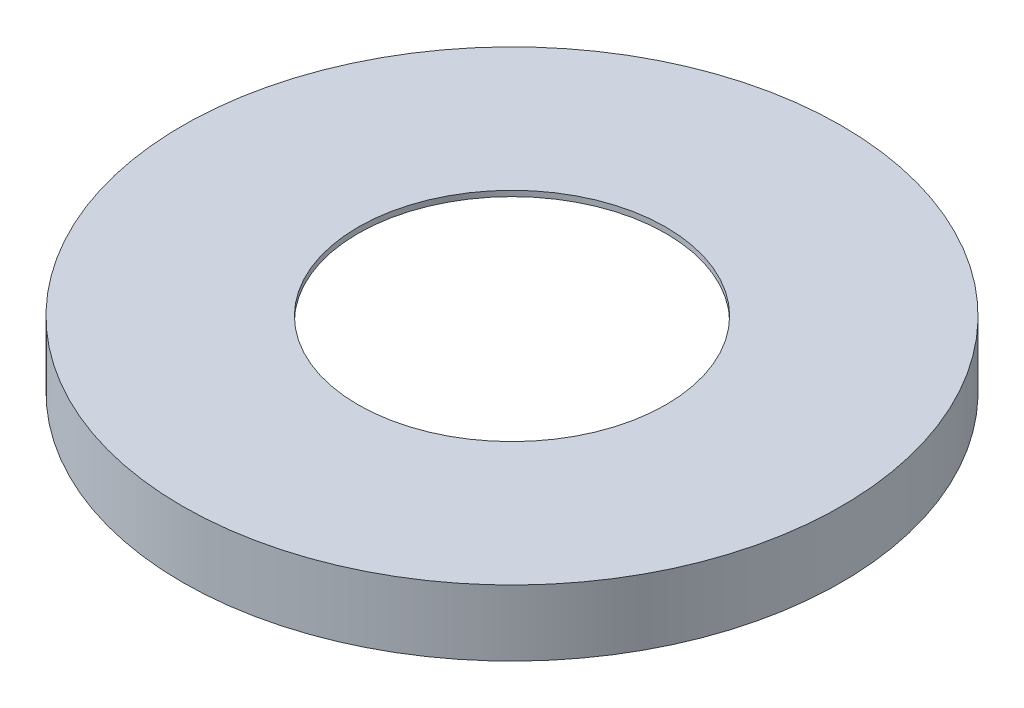
ISO-10303-21;
HEADER;
FILE_DESCRIPTION(('STEP AP214'),'2;1');
FILE_NAME('part.step','',(''),(''),'','','');
FILE_SCHEMA(('AUTOMOTIVE_DESIGN { 1 0 10303 214 1 1 1 1 }'));
ENDSEC;
DATA;
#1=APPLICATION_CONTEXT('core data for automotive mechanical design processes');
#2=APPLICATION_PROTOCOL_DEFINITION('international standard','automotive_design',2000,#1);
#3=PRODUCT_CONTEXT('',#1,'mechanical');
#4=PRODUCT('Part','Part','',(#3));
#5=PRODUCT_RELATED_PRODUCT_CATEGORY('part','',(#4));
#6=PRODUCT_DEFINITION_FORMATION('','',#4);
#7=PRODUCT_DEFINITION_CONTEXT('part definition',#1,'design');
#8=PRODUCT_DEFINITION('design','',#6,#7);
#9=PRODUCT_DEFINITION_SHAPE('','',#8);
#10=(LENGTH_UNIT() NAMED_UNIT(*) SI_UNIT(.MILLI.,.METRE.));
#11=(NAMED_UNIT(*) PLANE_ANGLE_UNIT() SI_UNIT($,.RADIAN.));
#12=(NAMED_UNIT(*) SI_UNIT($,.STERADIAN.) SOLID_ANGLE_UNIT());
#13=UNCERTAINTY_MEASURE_WITH_UNIT(LENGTH_MEASURE(1.E-05),#10,'distance_accuracy_value','');
#14=(GEOMETRIC_REPRESENTATION_CONTEXT(3) GLOBAL_UNCERTAINTY_ASSIGNED_CONTEXT((#13)) GLOBAL_UNIT_ASSIGNED_CONTEXT((#10,
#11,#12)) REPRESENTATION_CONTEXT('',''));
#15=CARTESIAN_POINT('',(0.,0.,0.));
#16=DIRECTION('',(0.,0.,1.));
#17=DIRECTION('',(1.,0.,0.));
#18=AXIS2_PLACEMENT_3D('',#15,#16,#17);
#19=CARTESIAN_POINT('',(0.,6.,0.));
#20=DIRECTION('',(0.,-1.,0.));
#21=DIRECTION('',(0.,0.,-1.));
#22=AXIS2_PLACEMENT_3D('',#19,#20,#21);
#23=CYLINDRICAL_SURFACE('',#22,14.01);
#24=CARTESIAN_POINT('',(0.,6.,0.));
#25=DIRECTION('',(0.,1.,0.));
#26=DIRECTION('',(0.,0.,1.));
#27=AXIS2_PLACEMENT_3D('',#24,#25,#26);
#28=CIRCLE('',#27,14.01);
#29=CARTESIAN_POINT('',(0.,6.,14.01));
#30=VERTEX_POINT('',#29);
#31=EDGE_CURVE('E56',#30,#30,#28,.T.);
#32=ORIENTED_EDGE('',*,*,#31,.T.);
#33=EDGE_LOOP('',(#32));
#34=FACE_BOUND('',#33,.T.);
#35=CARTESIAN_POINT('',(0.,5.5,0.));
#36=DIRECTION('',(0.,-1.,0.));
#37=DIRECTION('',(0.,0.,-1.));
#38=AXIS2_PLACEMENT_3D('',#35,#36,#37);
#39=CIRCLE('',#38,14.01);
#40=CARTESIAN_POINT('',(0.,5.5,-14.01));
#41=VERTEX_POINT('',#40);
#42=EDGE_CURVE('E45',#41,#41,#39,.T.);
#43=ORIENTED_EDGE('',*,*,#42,.T.);
#44=EDGE_LOOP('',(#43));
#45=FACE_BOUND('',#44,.T.);
#46=ADVANCED_FACE('F41',(#34,#45),#23,.F.);
#47=CARTESIAN_POINT('',(0.,6.,0.));
#48=DIRECTION('',(0.,1.,0.));
#49=DIRECTION('',(0.,0.,1.));
#50=AXIS2_PLACEMENT_3D('',#47,#48,#49);
#51=PLANE('',#50);
#52=CARTESIAN_POINT('',(0.,6.,0.));
#53=DIRECTION('',(0.,1.,0.));
#54=DIRECTION('',(0.,0.,1.));
#55=AXIS2_PLACEMENT_3D('',#52,#53,#54);
#56=CIRCLE('',#55,30.);
#57=CARTESIAN_POINT('',(0.,6.,30.));
#58=VERTEX_POINT('',#57);
#59=EDGE_CURVE('E10',#58,#58,#56,.T.);
#60=ORIENTED_EDGE('',*,*,#59,.T.);
#61=EDGE_LOOP('',(#60));
#62=FACE_BOUND('',#61,.T.);
#63=ORIENTED_EDGE('',*,*,#31,.F.);
#64=EDGE_LOOP('',(#63));
#65=FACE_BOUND('',#64,.T.);
#66=ADVANCED_FACE('F85',(#62,#65),#51,.T.);
#67=CARTESIAN_POINT('',(0.,0.,0.));
#68=DIRECTION('',(0.,1.,0.));
#69=DIRECTION('',(0.,0.,1.));
#70=AXIS2_PLACEMENT_3D('',#67,#68,#69);
#71=PLANE('',#70);
#72=CARTESIAN_POINT('',(0.,0.,0.));
#73=DIRECTION('',(0.,-1.,0.));
#74=DIRECTION('',(0.,0.,-1.));
#75=AXIS2_PLACEMENT_3D('',#72,#73,#74);
#76=CIRCLE('',#75,29.);
#77=CARTESIAN_POINT('',(0.,0.,-29.));
#78=VERTEX_POINT('',#77);
#79=EDGE_CURVE('E61',#78,#78,#76,.T.);
#80=ORIENTED_EDGE('',*,*,#79,.F.);
#81=EDGE_LOOP('',(#80));
#82=FACE_BOUND('',#81,.T.);
#83=CARTESIAN_POINT('',(0.,0.,0.));
#84=DIRECTION('',(0.,1.,0.));
#85=DIRECTION('',(0.,0.,1.));
#86=AXIS2_PLACEMENT_3D('',#83,#84,#85);
#87=CIRCLE('',#86,30.);
#88=CARTESIAN_POINT('',(0.,0.,30.));
#89=VERTEX_POINT('',#88);
#90=EDGE_CURVE('E50',#89,#89,#87,.T.);
#91=ORIENTED_EDGE('',*,*,#90,.F.);
#92=EDGE_LOOP('',(#91));
#93=FACE_BOUND('',#92,.T.);
#94=ADVANCED_FACE('F91',(#82,#93),#71,.F.);
#95=CARTESIAN_POINT('',(0.,6.,0.));
#96=DIRECTION('',(0.,-1.,0.));
#97=DIRECTION('',(0.,0.,-1.));
#98=AXIS2_PLACEMENT_3D('',#95,#96,#97);
#99=CYLINDRICAL_SURFACE('',#98,30.);
#100=ORIENTED_EDGE('',*,*,#59,.F.);
#101=EDGE_LOOP('',(#100));
#102=FACE_BOUND('',#101,.T.);
#103=ORIENTED_EDGE('',*,*,#90,.T.);
#104=EDGE_LOOP('',(#103));
#105=FACE_BOUND('',#104,.T.);
#106=ADVANCED_FACE('F43',(#102,#105),#99,.T.);
#107=CARTESIAN_POINT('',(0.,5.5,0.));
#108=DIRECTION('',(0.,-1.,0.));
#109=DIRECTION('',(0.,0.,-1.));
#110=AXIS2_PLACEMENT_3D('',#107,#108,#109);
#111=CYLINDRICAL_SURFACE('',#110,29.);
#112=CARTESIAN_POINT('',(0.,5.5,0.));
#113=DIRECTION('',(0.,-1.,0.));
#114=DIRECTION('',(0.,0.,-1.));
#115=AXIS2_PLACEMENT_3D('',#112,#113,#114);
#116=CIRCLE('',#115,29.);
#117=CARTESIAN_POINT('',(0.,5.5,-29.));
#118=VERTEX_POINT('',#117);
#119=EDGE_CURVE('E65',#118,#118,#116,.T.);
#120=ORIENTED_EDGE('',*,*,#119,.F.);
#121=EDGE_LOOP('',(#120));
#122=FACE_BOUND('',#121,.T.);
#123=ORIENTED_EDGE('',*,*,#79,.T.);
#124=EDGE_LOOP('',(#123));
#125=FACE_BOUND('',#124,.T.);
#126=ADVANCED_FACE('F77',(#122,#125),#111,.F.);
#127=CARTESIAN_POINT('',(0.,5.5,0.));
#128=DIRECTION('',(0.,-1.,0.));
#129=DIRECTION('',(0.,0.,-1.));
#130=AXIS2_PLACEMENT_3D('',#127,#128,#129);
#131=PLANE('',#130);
#132=ORIENTED_EDGE('',*,*,#42,.F.);
#133=EDGE_LOOP('',(#132));
#134=FACE_BOUND('',#133,.T.);
#135=ORIENTED_EDGE('',*,*,#119,.T.);
#136=EDGE_LOOP('',(#135));
#137=FACE_BOUND('',#136,.T.);
#138=ADVANCED_FACE('F75',(#134,#137),#131,.T.);
#139=CLOSED_SHELL('',(#46,#66,#94,#106,#126,#138));
#140=MANIFOLD_SOLID_BREP('B2',#139);
#141=ADVANCED_BREP_SHAPE_REPRESENTATION('',(#18,#140),#14);
#142=SHAPE_DEFINITION_REPRESENTATION(#9,#141);
ENDSEC;
END-ISO-10303-21;
